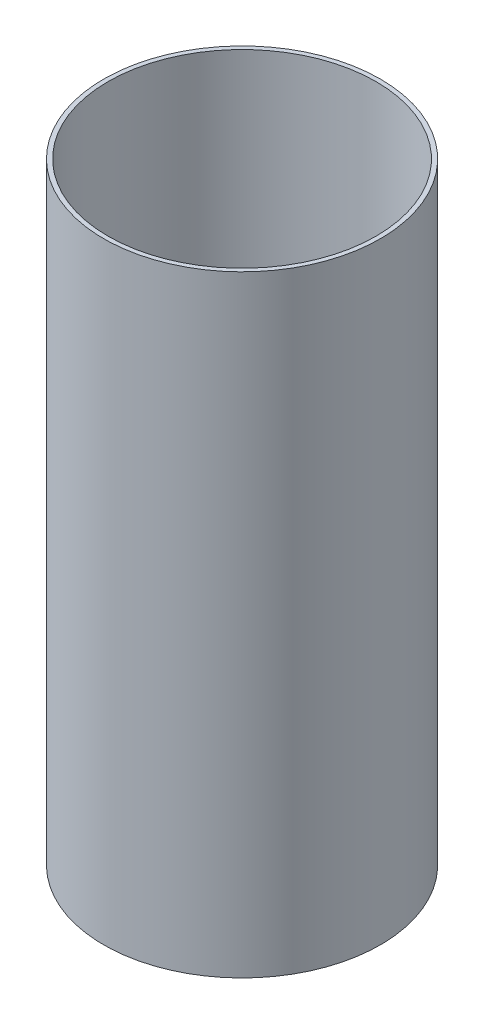
ISO-10303-21;
HEADER;
FILE_DESCRIPTION(('STEP AP214'),'2;1');
FILE_NAME('part.step','',(''),(''),'','','');
FILE_SCHEMA(('AUTOMOTIVE_DESIGN { 1 0 10303 214 1 1 1 1 }'));
ENDSEC;
DATA;
#1=APPLICATION_CONTEXT('core data for automotive mechanical design processes');
#2=APPLICATION_PROTOCOL_DEFINITION('international standard','automotive_design',2000,#1);
#3=PRODUCT_CONTEXT('',#1,'mechanical');
#4=PRODUCT('Part','Part','',(#3));
#5=PRODUCT_RELATED_PRODUCT_CATEGORY('part','',(#4));
#6=PRODUCT_DEFINITION_FORMATION('','',#4);
#7=PRODUCT_DEFINITION_CONTEXT('part definition',#1,'design');
#8=PRODUCT_DEFINITION('design','',#6,#7);
#9=PRODUCT_DEFINITION_SHAPE('','',#8);
#10=(LENGTH_UNIT() NAMED_UNIT(*) SI_UNIT(.MILLI.,.METRE.));
#11=(NAMED_UNIT(*) PLANE_ANGLE_UNIT() SI_UNIT($,.RADIAN.));
#12=(NAMED_UNIT(*) SI_UNIT($,.STERADIAN.) SOLID_ANGLE_UNIT());
#13=UNCERTAINTY_MEASURE_WITH_UNIT(LENGTH_MEASURE(1.E-05),#10,'distance_accuracy_value','');
#14=(GEOMETRIC_REPRESENTATION_CONTEXT(3) GLOBAL_UNCERTAINTY_ASSIGNED_CONTEXT((#13)) GLOBAL_UNIT_ASSIGNED_CONTEXT((#10,
#11,#12)) REPRESENTATION_CONTEXT('',''));
#15=CARTESIAN_POINT('',(0.,0.,0.));
#16=DIRECTION('',(0.,0.,1.));
#17=DIRECTION('',(1.,0.,0.));
#18=AXIS2_PLACEMENT_3D('',#15,#16,#17);
#19=CARTESIAN_POINT('',(0.,42.,0.));
#20=DIRECTION('',(0.,1.,0.));
#21=DIRECTION('',(0.,0.,1.));
#22=AXIS2_PLACEMENT_3D('',#19,#20,#21);
#23=PLANE('',#22);
#24=CARTESIAN_POINT('',(0.,42.,0.));
#25=DIRECTION('',(0.,1.,0.));
#26=DIRECTION('',(0.,0.,1.));
#27=AXIS2_PLACEMENT_3D('',#24,#25,#26);
#28=CIRCLE('',#27,19.);
#29=CARTESIAN_POINT('',(0.,42.,-19.));
#30=VERTEX_POINT('',#29);
#31=EDGE_CURVE('E10',#30,#30,#28,.T.);
#32=ORIENTED_EDGE('',*,*,#31,.T.);
#33=EDGE_LOOP('',(#32));
#34=FACE_BOUND('',#33,.T.);
#35=CARTESIAN_POINT('',(0.,42.,0.));
#36=DIRECTION('',(0.,1.,0.));
#37=DIRECTION('',(0.,0.,1.));
#38=AXIS2_PLACEMENT_3D('',#35,#36,#37);
#39=CIRCLE('',#38,18.4);
#40=CARTESIAN_POINT('',(0.,42.,-18.4));
#41=VERTEX_POINT('',#40);
#42=EDGE_CURVE('E54',#41,#41,#39,.T.);
#43=ORIENTED_EDGE('',*,*,#42,.F.);
#44=EDGE_LOOP('',(#43));
#45=FACE_BOUND('',#44,.T.);
#46=ADVANCED_FACE('F41',(#34,#45),#23,.T.);
#47=CARTESIAN_POINT('',(0.,-42.,0.));
#48=DIRECTION('',(0.,1.,0.));
#49=DIRECTION('',(0.,0.,1.));
#50=AXIS2_PLACEMENT_3D('',#47,#48,#49);
#51=PLANE('',#50);
#52=CARTESIAN_POINT('',(0.,-42.,0.));
#53=DIRECTION('',(0.,1.,0.));
#54=DIRECTION('',(0.,0.,1.));
#55=AXIS2_PLACEMENT_3D('',#52,#53,#54);
#56=CIRCLE('',#55,19.);
#57=CARTESIAN_POINT('',(0.,-42.,-19.));
#58=VERTEX_POINT('',#57);
#59=EDGE_CURVE('E45',#58,#58,#56,.T.);
#60=ORIENTED_EDGE('',*,*,#59,.F.);
#61=EDGE_LOOP('',(#60));
#62=FACE_BOUND('',#61,.T.);
#63=CARTESIAN_POINT('',(0.,-42.,0.));
#64=DIRECTION('',(0.,1.,0.));
#65=DIRECTION('',(0.,0.,1.));
#66=AXIS2_PLACEMENT_3D('',#63,#64,#65);
#67=CIRCLE('',#66,18.4);
#68=CARTESIAN_POINT('',(0.,-42.,-18.4));
#69=VERTEX_POINT('',#68);
#70=EDGE_CURVE('E56',#69,#69,#67,.T.);
#71=ORIENTED_EDGE('',*,*,#70,.T.);
#72=EDGE_LOOP('',(#71));
#73=FACE_BOUND('',#72,.T.);
#74=ADVANCED_FACE('F68',(#62,#73),#51,.F.);
#75=CARTESIAN_POINT('',(0.,42.,0.));
#76=DIRECTION('',(0.,-1.,0.));
#77=DIRECTION('',(0.,0.,-1.));
#78=AXIS2_PLACEMENT_3D('',#75,#76,#77);
#79=CYLINDRICAL_SURFACE('',#78,19.);
#80=CARTESIAN_POINT('',(0.,42.,-19.));
#81=CARTESIAN_POINT('',(0.,41.125,-19.));
#82=CARTESIAN_POINT('',(0.,40.25,-19.));
#83=CARTESIAN_POINT('',(0.,38.5,-19.));
#84=CARTESIAN_POINT('',(0.,37.625,-19.));
#85=CARTESIAN_POINT('',(0.,35.875,-19.));
#86=CARTESIAN_POINT('',(0.,35.,-19.));
#87=CARTESIAN_POINT('',(0.,33.25,-19.));
#88=CARTESIAN_POINT('',(0.,32.375,-19.));
#89=CARTESIAN_POINT('',(0.,30.625,-19.));
#90=CARTESIAN_POINT('',(0.,29.75,-19.));
#91=CARTESIAN_POINT('',(0.,28.,-19.));
#92=CARTESIAN_POINT('',(0.,27.125,-19.));
#93=CARTESIAN_POINT('',(0.,25.375,-19.));
#94=CARTESIAN_POINT('',(0.,24.5,-19.));
#95=CARTESIAN_POINT('',(0.,22.75,-19.));
#96=CARTESIAN_POINT('',(0.,21.875,-19.));
#97=CARTESIAN_POINT('',(0.,20.125,-19.));
#98=CARTESIAN_POINT('',(0.,19.25,-19.));
#99=CARTESIAN_POINT('',(0.,17.5,-19.));
#100=CARTESIAN_POINT('',(0.,16.625,-19.));
#101=CARTESIAN_POINT('',(0.,14.875,-19.));
#102=CARTESIAN_POINT('',(0.,14.,-19.));
#103=CARTESIAN_POINT('',(0.,12.25,-19.));
#104=CARTESIAN_POINT('',(0.,11.375,-19.));
#105=CARTESIAN_POINT('',(0.,9.625,-19.));
#106=CARTESIAN_POINT('',(0.,8.75,-19.));
#107=CARTESIAN_POINT('',(0.,7.,-19.));
#108=CARTESIAN_POINT('',(0.,6.125,-19.));
#109=CARTESIAN_POINT('',(0.,4.375,-19.));
#110=CARTESIAN_POINT('',(0.,3.5,-19.));
#111=CARTESIAN_POINT('',(0.,1.75,-19.));
#112=CARTESIAN_POINT('',(0.,0.875000000000001,-19.));
#113=CARTESIAN_POINT('',(0.,-0.875000000000001,-19.));
#114=CARTESIAN_POINT('',(0.,-1.75,-19.));
#115=CARTESIAN_POINT('',(0.,-3.5,-19.));
#116=CARTESIAN_POINT('',(0.,-4.375,-19.));
#117=CARTESIAN_POINT('',(0.,-6.125,-19.));
#118=CARTESIAN_POINT('',(0.,-7.,-19.));
#119=CARTESIAN_POINT('',(0.,-8.75,-19.));
#120=CARTESIAN_POINT('',(0.,-9.625,-19.));
#121=CARTESIAN_POINT('',(0.,-11.375,-19.));
#122=CARTESIAN_POINT('',(0.,-12.25,-19.));
#123=CARTESIAN_POINT('',(0.,-14.,-19.));
#124=CARTESIAN_POINT('',(0.,-14.875,-19.));
#125=CARTESIAN_POINT('',(0.,-16.625,-19.));
#126=CARTESIAN_POINT('',(0.,-17.5,-19.));
#127=CARTESIAN_POINT('',(0.,-19.25,-19.));
#128=CARTESIAN_POINT('',(0.,-20.125,-19.));
#129=CARTESIAN_POINT('',(0.,-21.875,-19.));
#130=CARTESIAN_POINT('',(0.,-22.75,-19.));
#131=CARTESIAN_POINT('',(0.,-24.5,-19.));
#132=CARTESIAN_POINT('',(0.,-25.375,-19.));
#133=CARTESIAN_POINT('',(0.,-27.125,-19.));
#134=CARTESIAN_POINT('',(0.,-28.,-19.));
#135=CARTESIAN_POINT('',(0.,-29.75,-19.));
#136=CARTESIAN_POINT('',(0.,-30.625,-19.));
#137=CARTESIAN_POINT('',(0.,-32.375,-19.));
#138=CARTESIAN_POINT('',(0.,-33.25,-19.));
#139=CARTESIAN_POINT('',(0.,-35.,-19.));
#140=CARTESIAN_POINT('',(0.,-35.875,-19.));
#141=CARTESIAN_POINT('',(0.,-37.625,-19.));
#142=CARTESIAN_POINT('',(0.,-38.5,-19.));
#143=CARTESIAN_POINT('',(0.,-40.25,-19.));
#144=CARTESIAN_POINT('',(0.,-41.125,-19.));
#145=CARTESIAN_POINT('',(0.,-42.,-19.));
#146=B_SPLINE_CURVE_WITH_KNOTS('',3,(#80,#81,#82,#83,#84,#85,#86,#87,#88,#89,#90,#91,#92,#93,
#94,#95,#96,#97,#98,#99,#100,#101,#102,#103,#104,#105,#106,#107,#108,#109,#110,#111,#112,#113,
#114,#115,#116,#117,#118,#119,#120,#121,#122,#123,#124,#125,#126,#127,#128,#129,#130,#131,#132,
#133,#134,#135,#136,#137,#138,#139,#140,#141,#142,#143,#144,#145),.UNSPECIFIED.,.F.,.F.,(4,2,2,
2,2,2,2,2,2,2,2,2,2,2,2,2,2,2,2,2,2,2,2,2,2,2,2,2,2,2,2,2,4),(0.,2.625,5.25,7.875,10.5,13.125,
15.75,18.375,21.,23.625,26.25,28.875,31.5,34.125,36.75,39.375,42.,44.625,47.25,49.875,52.5,
55.125,57.75,60.375,63.,65.625,68.25,70.875,73.5,76.125,78.75,81.375,84.),.UNSPECIFIED.);
#147=EDGE_CURVE('BSEAM43',#30,#58,#146,.T.);
#148=ORIENTED_EDGE('',*,*,#31,.F.);
#149=ORIENTED_EDGE('',*,*,#59,.T.);
#150=ORIENTED_EDGE('',*,*,#147,.T.);
#151=ORIENTED_EDGE('',*,*,#147,.F.);
#152=EDGE_LOOP('',(#148,#150,#149,#151));
#153=FACE_BOUND('',#152,.T.);
#154=ADVANCED_FACE('F43',(#153),#79,.T.);
#155=CARTESIAN_POINT('',(0.,42.,0.));
#156=DIRECTION('',(0.,-1.,0.));
#157=DIRECTION('',(0.,0.,-1.));
#158=AXIS2_PLACEMENT_3D('',#155,#156,#157);
#159=CYLINDRICAL_SURFACE('',#158,18.4);
#160=CARTESIAN_POINT('',(0.,42.,-18.4));
#161=CARTESIAN_POINT('',(0.,41.125,-18.4));
#162=CARTESIAN_POINT('',(0.,40.25,-18.4));
#163=CARTESIAN_POINT('',(0.,38.5,-18.4));
#164=CARTESIAN_POINT('',(0.,37.625,-18.4));
#165=CARTESIAN_POINT('',(0.,35.875,-18.4));
#166=CARTESIAN_POINT('',(0.,35.,-18.4));
#167=CARTESIAN_POINT('',(0.,33.25,-18.4));
#168=CARTESIAN_POINT('',(0.,32.375,-18.4));
#169=CARTESIAN_POINT('',(0.,30.625,-18.4));
#170=CARTESIAN_POINT('',(0.,29.75,-18.4));
#171=CARTESIAN_POINT('',(0.,28.,-18.4));
#172=CARTESIAN_POINT('',(0.,27.125,-18.4));
#173=CARTESIAN_POINT('',(0.,25.375,-18.4));
#174=CARTESIAN_POINT('',(0.,24.5,-18.4));
#175=CARTESIAN_POINT('',(0.,22.75,-18.4));
#176=CARTESIAN_POINT('',(0.,21.875,-18.4));
#177=CARTESIAN_POINT('',(0.,20.125,-18.4));
#178=CARTESIAN_POINT('',(0.,19.25,-18.4));
#179=CARTESIAN_POINT('',(0.,17.5,-18.4));
#180=CARTESIAN_POINT('',(0.,16.625,-18.4));
#181=CARTESIAN_POINT('',(0.,14.875,-18.4));
#182=CARTESIAN_POINT('',(0.,14.,-18.4));
#183=CARTESIAN_POINT('',(0.,12.25,-18.4));
#184=CARTESIAN_POINT('',(0.,11.375,-18.4));
#185=CARTESIAN_POINT('',(0.,9.625,-18.4));
#186=CARTESIAN_POINT('',(0.,8.75,-18.4));
#187=CARTESIAN_POINT('',(0.,7.,-18.4));
#188=CARTESIAN_POINT('',(0.,6.125,-18.4));
#189=CARTESIAN_POINT('',(0.,4.375,-18.4));
#190=CARTESIAN_POINT('',(0.,3.5,-18.4));
#191=CARTESIAN_POINT('',(0.,1.75,-18.4));
#192=CARTESIAN_POINT('',(0.,0.875000000000001,-18.4));
#193=CARTESIAN_POINT('',(0.,-0.875000000000001,-18.4));
#194=CARTESIAN_POINT('',(0.,-1.75,-18.4));
#195=CARTESIAN_POINT('',(0.,-3.5,-18.4));
#196=CARTESIAN_POINT('',(0.,-4.375,-18.4));
#197=CARTESIAN_POINT('',(0.,-6.125,-18.4));
#198=CARTESIAN_POINT('',(0.,-7.,-18.4));
#199=CARTESIAN_POINT('',(0.,-8.75,-18.4));
#200=CARTESIAN_POINT('',(0.,-9.625,-18.4));
#201=CARTESIAN_POINT('',(0.,-11.375,-18.4));
#202=CARTESIAN_POINT('',(0.,-12.25,-18.4));
#203=CARTESIAN_POINT('',(0.,-14.,-18.4));
#204=CARTESIAN_POINT('',(0.,-14.875,-18.4));
#205=CARTESIAN_POINT('',(0.,-16.625,-18.4));
#206=CARTESIAN_POINT('',(0.,-17.5,-18.4));
#207=CARTESIAN_POINT('',(0.,-19.25,-18.4));
#208=CARTESIAN_POINT('',(0.,-20.125,-18.4));
#209=CARTESIAN_POINT('',(0.,-21.875,-18.4));
#210=CARTESIAN_POINT('',(0.,-22.75,-18.4));
#211=CARTESIAN_POINT('',(0.,-24.5,-18.4));
#212=CARTESIAN_POINT('',(0.,-25.375,-18.4));
#213=CARTESIAN_POINT('',(0.,-27.125,-18.4));
#214=CARTESIAN_POINT('',(0.,-28.,-18.4));
#215=CARTESIAN_POINT('',(0.,-29.75,-18.4));
#216=CARTESIAN_POINT('',(0.,-30.625,-18.4));
#217=CARTESIAN_POINT('',(0.,-32.375,-18.4));
#218=CARTESIAN_POINT('',(0.,-33.25,-18.4));
#219=CARTESIAN_POINT('',(0.,-35.,-18.4));
#220=CARTESIAN_POINT('',(0.,-35.875,-18.4));
#221=CARTESIAN_POINT('',(0.,-37.625,-18.4));
#222=CARTESIAN_POINT('',(0.,-38.5,-18.4));
#223=CARTESIAN_POINT('',(0.,-40.25,-18.4));
#224=CARTESIAN_POINT('',(0.,-41.125,-18.4));
#225=CARTESIAN_POINT('',(0.,-42.,-18.4));
#226=B_SPLINE_CURVE_WITH_KNOTS('',3,(#160,#161,#162,#163,#164,#165,#166,#167,#168,#169,#170,
#171,#172,#173,#174,#175,#176,#177,#178,#179,#180,#181,#182,#183,#184,#185,#186,#187,#188,#189,
#190,#191,#192,#193,#194,#195,#196,#197,#198,#199,#200,#201,#202,#203,#204,#205,#206,#207,#208,
#209,#210,#211,#212,#213,#214,#215,#216,#217,#218,#219,#220,#221,#222,#223,#224,#225),
.UNSPECIFIED.,.F.,.F.,(4,2,2,2,2,2,2,2,2,2,2,2,2,2,2,2,2,2,2,2,2,2,2,2,2,2,2,2,2,2,2,2,4),(0.,
2.625,5.25,7.875,10.5,13.125,15.75,18.375,21.,23.625,26.25,28.875,31.5,34.125,36.75,39.375,42.,
44.625,47.25,49.875,52.5,55.125,57.75,60.375,63.,65.625,68.25,70.875,73.5,76.125,78.75,81.375,
84.),.UNSPECIFIED.);
#227=EDGE_CURVE('BSEAM64',#41,#69,#226,.T.);
#228=ORIENTED_EDGE('',*,*,#42,.T.);
#229=ORIENTED_EDGE('',*,*,#70,.F.);
#230=ORIENTED_EDGE('',*,*,#227,.T.);
#231=ORIENTED_EDGE('',*,*,#227,.F.);
#232=EDGE_LOOP('',(#228,#230,#229,#231));
#233=FACE_BOUND('',#232,.T.);
#234=ADVANCED_FACE('F64',(#233),#159,.F.);
#235=CLOSED_SHELL('',(#46,#74,#154,#234));
#236=MANIFOLD_SOLID_BREP('B2',#235);
#237=ADVANCED_BREP_SHAPE_REPRESENTATION('',(#18,#236),#14);
#238=SHAPE_DEFINITION_REPRESENTATION(#9,#237);
ENDSEC;
END-ISO-10303-21;
